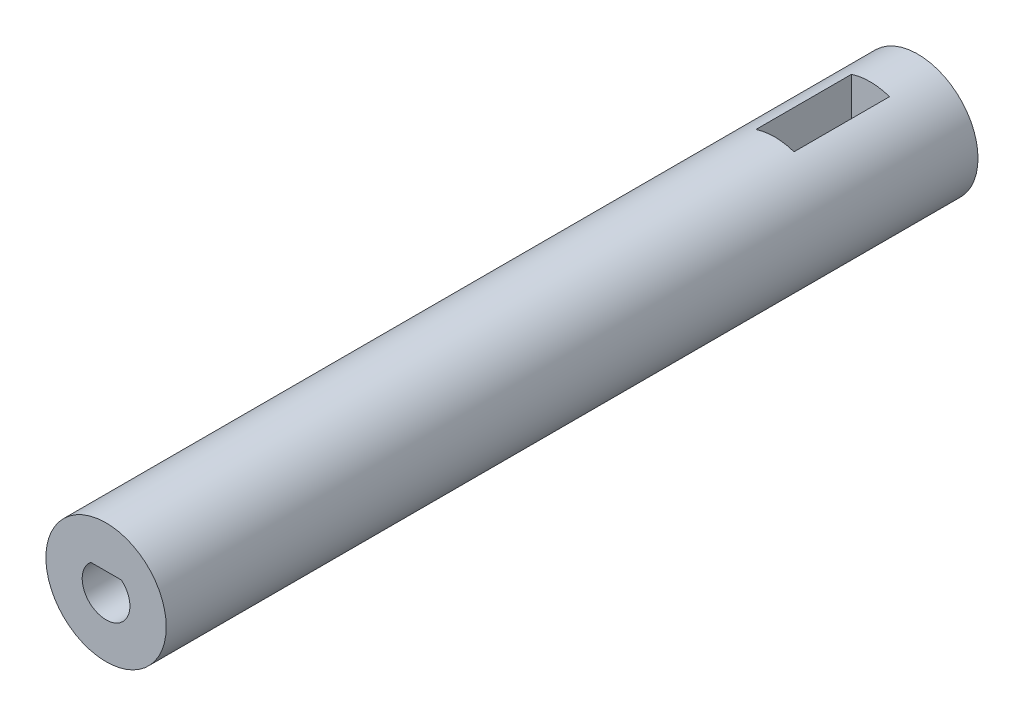
ISO-10303-21;
HEADER;
FILE_DESCRIPTION(('STEP AP214'),'2;1');
FILE_NAME('part.step','',(''),(''),'','','');
FILE_SCHEMA(('AUTOMOTIVE_DESIGN { 1 0 10303 214 1 1 1 1 }'));
ENDSEC;
DATA;
#1=APPLICATION_CONTEXT('core data for automotive mechanical design processes');
#2=APPLICATION_PROTOCOL_DEFINITION('international standard','automotive_design',2000,#1);
#3=PRODUCT_CONTEXT('',#1,'mechanical');
#4=PRODUCT('Part','Part','',(#3));
#5=PRODUCT_RELATED_PRODUCT_CATEGORY('part','',(#4));
#6=PRODUCT_DEFINITION_FORMATION('','',#4);
#7=PRODUCT_DEFINITION_CONTEXT('part definition',#1,'design');
#8=PRODUCT_DEFINITION('design','',#6,#7);
#9=PRODUCT_DEFINITION_SHAPE('','',#8);
#10=(LENGTH_UNIT() NAMED_UNIT(*) SI_UNIT(.MILLI.,.METRE.));
#11=(NAMED_UNIT(*) PLANE_ANGLE_UNIT() SI_UNIT($,.RADIAN.));
#12=(NAMED_UNIT(*) SI_UNIT($,.STERADIAN.) SOLID_ANGLE_UNIT());
#13=UNCERTAINTY_MEASURE_WITH_UNIT(LENGTH_MEASURE(1.E-05),#10,'distance_accuracy_value','');
#14=(GEOMETRIC_REPRESENTATION_CONTEXT(3) GLOBAL_UNCERTAINTY_ASSIGNED_CONTEXT((#13)) GLOBAL_UNIT_ASSIGNED_CONTEXT((#10,
#11,#12)) REPRESENTATION_CONTEXT('',''));
#15=CARTESIAN_POINT('',(0.,0.,0.));
#16=DIRECTION('',(0.,0.,1.));
#17=DIRECTION('',(1.,0.,0.));
#18=AXIS2_PLACEMENT_3D('',#15,#16,#17);
#19=CARTESIAN_POINT('',(0.,0.,-5.));
#20=DIRECTION('',(0.,0.,1.));
#21=DIRECTION('',(1.,0.,0.));
#22=AXIS2_PLACEMENT_3D('',#19,#20,#21);
#23=CYLINDRICAL_SURFACE('',#22,6.3);
#24=CARTESIAN_POINT('',(0.,0.,-5.));
#25=DIRECTION('',(0.,0.,1.));
#26=DIRECTION('',(1.,0.,0.));
#27=AXIS2_PLACEMENT_3D('',#24,#25,#26);
#28=CIRCLE('',#27,6.3);
#29=CARTESIAN_POINT('',(6.3,0.,-5.));
#30=VERTEX_POINT('',#29);
#31=EDGE_CURVE('E141',#30,#30,#28,.T.);
#32=ORIENTED_EDGE('',*,*,#31,.T.);
#33=EDGE_LOOP('',(#32));
#34=FACE_BOUND('',#33,.T.);
#35=CARTESIAN_POINT('',(0.,0.,80.));
#36=DIRECTION('',(0.,0.,1.));
#37=DIRECTION('',(1.,0.,0.));
#38=AXIS2_PLACEMENT_3D('',#35,#36,#37);
#39=CIRCLE('',#38,6.3);
#40=CARTESIAN_POINT('',(6.3,0.,80.));
#41=VERTEX_POINT('',#40);
#42=EDGE_CURVE('E138',#41,#41,#39,.T.);
#43=ORIENTED_EDGE('',*,*,#42,.F.);
#44=EDGE_LOOP('',(#43));
#45=FACE_BOUND('',#44,.T.);
#46=CARTESIAN_POINT('',(0.,0.,10.));
#47=DIRECTION('',(0.,0.,1.));
#48=DIRECTION('',(1.,0.,0.));
#49=AXIS2_PLACEMENT_3D('',#46,#47,#48);
#50=CIRCLE('',#49,6.3);
#51=CARTESIAN_POINT('',(-1.95516009173228,5.98893554946932,10.));
#52=VERTEX_POINT('',#51);
#53=CARTESIAN_POINT('',(2.03835839350811,5.96113202836635,10.));
#54=VERTEX_POINT('',#53);
#55=EDGE_CURVE('E55',#52,#54,#50,.F.);
#56=ORIENTED_EDGE('',*,*,#55,.F.);
#57=DIRECTION('',(0.,0.,1.));
#58=VECTOR('',#57,1.);
#59=CARTESIAN_POINT('',(-1.95516009173228,5.98893554946932,-5.));
#60=LINE('',#59,#58);
#61=CARTESIAN_POINT('',(-1.95516009173228,5.98893554946932,0.));
#62=VERTEX_POINT('',#61);
#63=EDGE_CURVE('E13',#52,#62,#60,.F.);
#64=ORIENTED_EDGE('',*,*,#63,.T.);
#65=CARTESIAN_POINT('',(0.,0.,0.));
#66=DIRECTION('',(0.,0.,-1.));
#67=DIRECTION('',(-1.,0.,0.));
#68=AXIS2_PLACEMENT_3D('',#65,#66,#67);
#69=CIRCLE('',#68,6.3);
#70=CARTESIAN_POINT('',(2.03835839350811,5.96113202836635,0.));
#71=VERTEX_POINT('',#70);
#72=EDGE_CURVE('E144',#71,#62,#69,.F.);
#73=ORIENTED_EDGE('',*,*,#72,.F.);
#74=DIRECTION('',(0.,0.,1.));
#75=VECTOR('',#74,1.);
#76=CARTESIAN_POINT('',(2.0383583935081,5.96113202836635,-5.));
#77=LINE('',#76,#75);
#78=EDGE_CURVE('E146',#54,#71,#77,.F.);
#79=ORIENTED_EDGE('',*,*,#78,.F.);
#80=EDGE_LOOP('',(#56,#64,#73,#79));
#81=FACE_BOUND('',#80,.T.);
#82=ADVANCED_FACE('F48',(#34,#45,#81),#23,.T.);
#83=CARTESIAN_POINT('',(0.,0.,-5.));
#84=DIRECTION('',(0.,0.,1.));
#85=DIRECTION('',(1.,0.,0.));
#86=AXIS2_PLACEMENT_3D('',#83,#84,#85);
#87=PLANE('',#86);
#88=ORIENTED_EDGE('',*,*,#31,.F.);
#89=EDGE_LOOP('',(#88));
#90=FACE_BOUND('',#89,.T.);
#91=ADVANCED_FACE('F176',(#90),#87,.F.);
#92=CARTESIAN_POINT('',(0.,0.,80.));
#93=DIRECTION('',(0.,0.,1.));
#94=DIRECTION('',(1.,0.,0.));
#95=AXIS2_PLACEMENT_3D('',#92,#93,#94);
#96=PLANE('',#95);
#97=CARTESIAN_POINT('',(0.,0.,80.));
#98=DIRECTION('',(0.,0.,1.));
#99=DIRECTION('',(1.,0.,0.));
#100=AXIS2_PLACEMENT_3D('',#97,#98,#99);
#101=CIRCLE('',#100,2.5);
#102=CARTESIAN_POINT('',(-1.60670281996654,1.91533444816083,80.));
#103=VERTEX_POINT('',#102);
#104=CARTESIAN_POINT('',(1.60670281996654,1.91533444816083,80.));
#105=VERTEX_POINT('',#104);
#106=EDGE_CURVE('E62',#103,#105,#101,.T.);
#107=ORIENTED_EDGE('',*,*,#106,.F.);
#108=DIRECTION('',(-1.,0.,0.));
#109=VECTOR('',#108,1.);
#110=CARTESIAN_POINT('',(0.,1.91533444816083,80.));
#111=LINE('',#110,#109);
#112=EDGE_CURVE('E112',#105,#103,#111,.T.);
#113=ORIENTED_EDGE('',*,*,#112,.F.);
#114=EDGE_LOOP('',(#107,#113));
#115=FACE_BOUND('',#114,.T.);
#116=ORIENTED_EDGE('',*,*,#42,.T.);
#117=EDGE_LOOP('',(#116));
#118=FACE_BOUND('',#117,.T.);
#119=ADVANCED_FACE('F181',(#115,#118),#96,.T.);
#120=CARTESIAN_POINT('',(-1.95516009173228,10.,0.));
#121=DIRECTION('',(1.,0.,0.));
#122=DIRECTION('',(0.,0.,-1.));
#123=AXIS2_PLACEMENT_3D('',#120,#121,#122);
#124=PLANE('',#123);
#125=DIRECTION('',(0.,-1.,0.));
#126=VECTOR('',#125,1.);
#127=CARTESIAN_POINT('',(-1.95516009173228,10.,10.));
#128=LINE('',#127,#126);
#129=CARTESIAN_POINT('',(-1.95516009173228,0.,10.));
#130=VERTEX_POINT('',#129);
#131=EDGE_CURVE('E134',#52,#130,#128,.T.);
#132=ORIENTED_EDGE('',*,*,#131,.T.);
#133=DIRECTION('',(0.,0.,1.));
#134=VECTOR('',#133,1.);
#135=CARTESIAN_POINT('',(-1.95516009173228,0.,0.));
#136=LINE('',#135,#134);
#137=CARTESIAN_POINT('',(-1.95516009173228,0.,0.));
#138=VERTEX_POINT('',#137);
#139=EDGE_CURVE('E119',#138,#130,#136,.T.);
#140=ORIENTED_EDGE('',*,*,#139,.F.);
#141=DIRECTION('',(0.,-1.,0.));
#142=VECTOR('',#141,1.);
#143=CARTESIAN_POINT('',(-1.95516009173228,10.,0.));
#144=LINE('',#143,#142);
#145=EDGE_CURVE('E136',#62,#138,#144,.T.);
#146=ORIENTED_EDGE('',*,*,#145,.F.);
#147=ORIENTED_EDGE('',*,*,#63,.F.);
#148=EDGE_LOOP('',(#132,#140,#146,#147));
#149=FACE_BOUND('',#148,.T.);
#150=ADVANCED_FACE('F164',(#149),#124,.T.);
#151=CARTESIAN_POINT('',(2.03835839350811,10.,10.));
#152=DIRECTION('',(0.,0.,1.));
#153=DIRECTION('',(1.,0.,0.));
#154=AXIS2_PLACEMENT_3D('',#151,#152,#153);
#155=PLANE('',#154);
#156=ORIENTED_EDGE('',*,*,#55,.T.);
#157=DIRECTION('',(0.,-1.,0.));
#158=VECTOR('',#157,1.);
#159=CARTESIAN_POINT('',(2.03835839350811,10.,10.));
#160=LINE('',#159,#158);
#161=CARTESIAN_POINT('',(2.03835839350811,0.,10.));
#162=VERTEX_POINT('',#161);
#163=EDGE_CURVE('E132',#54,#162,#160,.T.);
#164=ORIENTED_EDGE('',*,*,#163,.T.);
#165=DIRECTION('',(-1.,0.,0.));
#166=VECTOR('',#165,1.);
#167=CARTESIAN_POINT('',(2.03835839350811,0.,10.));
#168=LINE('',#167,#166);
#169=EDGE_CURVE('E123',#162,#130,#168,.T.);
#170=ORIENTED_EDGE('',*,*,#169,.T.);
#171=ORIENTED_EDGE('',*,*,#131,.F.);
#172=EDGE_LOOP('',(#156,#164,#170,#171));
#173=FACE_BOUND('',#172,.T.);
#174=ADVANCED_FACE('F151',(#173),#155,.F.);
#175=CARTESIAN_POINT('',(2.03835839350811,10.,0.));
#176=DIRECTION('',(1.,0.,0.));
#177=DIRECTION('',(0.,0.,-1.));
#178=AXIS2_PLACEMENT_3D('',#175,#176,#177);
#179=PLANE('',#178);
#180=ORIENTED_EDGE('',*,*,#78,.T.);
#181=DIRECTION('',(0.,-1.,0.));
#182=VECTOR('',#181,1.);
#183=CARTESIAN_POINT('',(2.03835839350811,10.,0.));
#184=LINE('',#183,#182);
#185=CARTESIAN_POINT('',(2.03835839350811,0.,0.));
#186=VERTEX_POINT('',#185);
#187=EDGE_CURVE('E70',#71,#186,#184,.T.);
#188=ORIENTED_EDGE('',*,*,#187,.T.);
#189=DIRECTION('',(0.,0.,1.));
#190=VECTOR('',#189,1.);
#191=CARTESIAN_POINT('',(2.03835839350811,0.,0.));
#192=LINE('',#191,#190);
#193=EDGE_CURVE('E126',#186,#162,#192,.T.);
#194=ORIENTED_EDGE('',*,*,#193,.T.);
#195=ORIENTED_EDGE('',*,*,#163,.F.);
#196=EDGE_LOOP('',(#180,#188,#194,#195));
#197=FACE_BOUND('',#196,.T.);
#198=ADVANCED_FACE('F156',(#197),#179,.F.);
#199=CARTESIAN_POINT('',(0.,10.,0.));
#200=DIRECTION('',(0.,0.,-1.));
#201=DIRECTION('',(-1.,0.,0.));
#202=AXIS2_PLACEMENT_3D('',#199,#200,#201);
#203=PLANE('',#202);
#204=ORIENTED_EDGE('',*,*,#72,.T.);
#205=ORIENTED_EDGE('',*,*,#145,.T.);
#206=DIRECTION('',(1.,0.,0.));
#207=VECTOR('',#206,1.);
#208=CARTESIAN_POINT('',(0.,0.,0.));
#209=LINE('',#208,#207);
#210=EDGE_CURVE('E129',#138,#186,#209,.T.);
#211=ORIENTED_EDGE('',*,*,#210,.T.);
#212=ORIENTED_EDGE('',*,*,#187,.F.);
#213=EDGE_LOOP('',(#204,#205,#211,#212));
#214=FACE_BOUND('',#213,.T.);
#215=ADVANCED_FACE('F160',(#214),#203,.F.);
#216=CARTESIAN_POINT('',(0.,0.,0.));
#217=DIRECTION('',(0.,1.,0.));
#218=DIRECTION('',(0.,0.,1.));
#219=AXIS2_PLACEMENT_3D('',#216,#217,#218);
#220=PLANE('',#219);
#221=ORIENTED_EDGE('',*,*,#139,.T.);
#222=ORIENTED_EDGE('',*,*,#169,.F.);
#223=ORIENTED_EDGE('',*,*,#193,.F.);
#224=ORIENTED_EDGE('',*,*,#210,.F.);
#225=EDGE_LOOP('',(#221,#222,#223,#224));
#226=FACE_BOUND('',#225,.T.);
#227=ADVANCED_FACE('F166',(#226),#220,.T.);
#228=CARTESIAN_POINT('',(0.,0.,63.));
#229=DIRECTION('',(0.,0.,1.));
#230=DIRECTION('',(1.,0.,0.));
#231=AXIS2_PLACEMENT_3D('',#228,#229,#230);
#232=CYLINDRICAL_SURFACE('',#231,2.5);
#233=ORIENTED_EDGE('',*,*,#106,.T.);
#234=DIRECTION('',(0.,0.,1.));
#235=VECTOR('',#234,1.);
#236=CARTESIAN_POINT('',(1.60670281996654,1.91533444816083,63.));
#237=LINE('',#236,#235);
#238=CARTESIAN_POINT('',(1.60670281996654,1.91533444816083,63.));
#239=VERTEX_POINT('',#238);
#240=EDGE_CURVE('E98',#239,#105,#237,.T.);
#241=ORIENTED_EDGE('',*,*,#240,.F.);
#242=CARTESIAN_POINT('',(0.,0.,63.));
#243=DIRECTION('',(0.,0.,1.));
#244=DIRECTION('',(1.,0.,0.));
#245=AXIS2_PLACEMENT_3D('',#242,#243,#244);
#246=CIRCLE('',#245,2.5);
#247=CARTESIAN_POINT('',(-1.60670281996654,1.91533444816083,63.));
#248=VERTEX_POINT('',#247);
#249=EDGE_CURVE('E101',#248,#239,#246,.T.);
#250=ORIENTED_EDGE('',*,*,#249,.F.);
#251=DIRECTION('',(0.,0.,1.));
#252=VECTOR('',#251,1.);
#253=CARTESIAN_POINT('',(-1.60670281996654,1.91533444816083,63.));
#254=LINE('',#253,#252);
#255=EDGE_CURVE('E107',#248,#103,#254,.T.);
#256=ORIENTED_EDGE('',*,*,#255,.T.);
#257=EDGE_LOOP('',(#233,#241,#250,#256));
#258=FACE_BOUND('',#257,.T.);
#259=ADVANCED_FACE('F100',(#258),#232,.F.);
#260=CARTESIAN_POINT('',(0.,1.91533444816083,63.));
#261=DIRECTION('',(0.,1.,0.));
#262=DIRECTION('',(0.,0.,1.));
#263=AXIS2_PLACEMENT_3D('',#260,#261,#262);
#264=PLANE('',#263);
#265=ORIENTED_EDGE('',*,*,#112,.T.);
#266=ORIENTED_EDGE('',*,*,#255,.F.);
#267=DIRECTION('',(-1.,0.,0.));
#268=VECTOR('',#267,1.);
#269=CARTESIAN_POINT('',(0.,1.91533444816083,63.));
#270=LINE('',#269,#268);
#271=EDGE_CURVE('E108',#239,#248,#270,.T.);
#272=ORIENTED_EDGE('',*,*,#271,.F.);
#273=ORIENTED_EDGE('',*,*,#240,.T.);
#274=EDGE_LOOP('',(#265,#266,#272,#273));
#275=FACE_BOUND('',#274,.T.);
#276=ADVANCED_FACE('F114',(#275),#264,.F.);
#277=CARTESIAN_POINT('',(0.,0.,63.));
#278=DIRECTION('',(0.,0.,1.));
#279=DIRECTION('',(1.,0.,0.));
#280=AXIS2_PLACEMENT_3D('',#277,#278,#279);
#281=PLANE('',#280);
#282=ORIENTED_EDGE('',*,*,#249,.T.);
#283=ORIENTED_EDGE('',*,*,#271,.T.);
#284=EDGE_LOOP('',(#282,#283));
#285=FACE_BOUND('',#284,.T.);
#286=ADVANCED_FACE('F111',(#285),#281,.T.);
#287=CLOSED_SHELL('',(#82,#91,#119,#150,#174,#198,#215,#227,#259,#276,#286));
#288=MANIFOLD_SOLID_BREP('B2',#287);
#289=ADVANCED_BREP_SHAPE_REPRESENTATION('',(#18,#288),#14);
#290=SHAPE_DEFINITION_REPRESENTATION(#9,#289);
ENDSEC;
END-ISO-10303-21;
